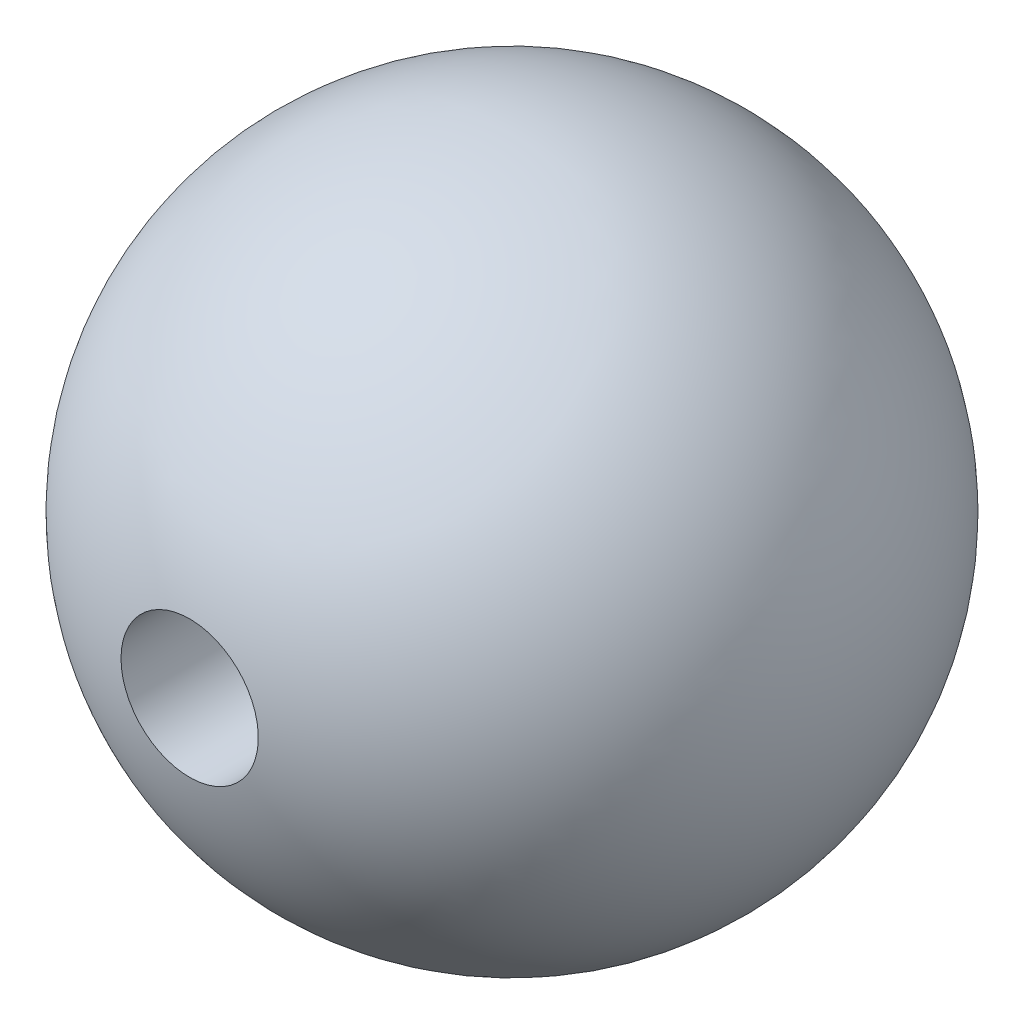
ISO-10303-21;
HEADER;
FILE_DESCRIPTION(('STEP AP214'),'2;1');
FILE_NAME('part.step','',(''),(''),'','','');
FILE_SCHEMA(('AUTOMOTIVE_DESIGN { 1 0 10303 214 1 1 1 1 }'));
ENDSEC;
DATA;
#1=APPLICATION_CONTEXT('core data for automotive mechanical design processes');
#2=APPLICATION_PROTOCOL_DEFINITION('international standard','automotive_design',2000,#1);
#3=PRODUCT_CONTEXT('',#1,'mechanical');
#4=PRODUCT('Part','Part','',(#3));
#5=PRODUCT_RELATED_PRODUCT_CATEGORY('part','',(#4));
#6=PRODUCT_DEFINITION_FORMATION('','',#4);
#7=PRODUCT_DEFINITION_CONTEXT('part definition',#1,'design');
#8=PRODUCT_DEFINITION('design','',#6,#7);
#9=PRODUCT_DEFINITION_SHAPE('','',#8);
#10=(LENGTH_UNIT() NAMED_UNIT(*) SI_UNIT(.MILLI.,.METRE.));
#11=(NAMED_UNIT(*) PLANE_ANGLE_UNIT() SI_UNIT($,.RADIAN.));
#12=(NAMED_UNIT(*) SI_UNIT($,.STERADIAN.) SOLID_ANGLE_UNIT());
#13=UNCERTAINTY_MEASURE_WITH_UNIT(LENGTH_MEASURE(1.E-05),#10,'distance_accuracy_value','');
#14=(GEOMETRIC_REPRESENTATION_CONTEXT(3) GLOBAL_UNCERTAINTY_ASSIGNED_CONTEXT((#13)) GLOBAL_UNIT_ASSIGNED_CONTEXT((#10,
#11,#12)) REPRESENTATION_CONTEXT('',''));
#15=CARTESIAN_POINT('',(0.,0.,0.));
#16=DIRECTION('',(0.,0.,1.));
#17=DIRECTION('',(1.,0.,0.));
#18=AXIS2_PLACEMENT_3D('',#15,#16,#17);
#19=CARTESIAN_POINT('',(0.,0.,0.));
#20=DIRECTION('',(-1.,0.,0.));
#21=DIRECTION('',(0.,1.,0.));
#22=AXIS2_PLACEMENT_3D('',#19,#20,#21);
#23=SPHERICAL_SURFACE('',#22,1.2);
#24=CARTESIAN_POINT('',(0.,0.,0.));
#25=DIRECTION('',(0.,0.,-1.));
#26=DIRECTION('',(-1.,0.,0.));
#27=AXIS2_PLACEMENT_3D('',#24,#25,#26);
#28=SPHERICAL_SURFACE('',#27,1.2);
#29=CARTESIAN_POINT('',(0.,0.,1.17366945943055));
#30=DIRECTION('',(0.,0.,-1.));
#31=DIRECTION('',(-1.,0.,0.));
#32=AXIS2_PLACEMENT_3D('',#29,#30,#31);
#33=CIRCLE('',#32,0.25);
#34=CARTESIAN_POINT('',(-0.25,0.,1.17366945943055));
#35=VERTEX_POINT('',#34);
#36=EDGE_CURVE('E10',#35,#35,#33,.T.);
#37=ORIENTED_EDGE('',*,*,#36,.T.);
#38=EDGE_LOOP('',(#37));
#39=FACE_BOUND('',#38,.T.);
#40=CARTESIAN_POINT('',(0.,0.,-1.17366945943055));
#41=DIRECTION('',(0.,0.,1.));
#42=DIRECTION('',(1.,0.,0.));
#43=AXIS2_PLACEMENT_3D('',#40,#41,#42);
#44=CIRCLE('',#43,0.25);
#45=CARTESIAN_POINT('',(0.25,0.,-1.17366945943055));
#46=VERTEX_POINT('',#45);
#47=EDGE_CURVE('E37',#46,#46,#44,.T.);
#48=ORIENTED_EDGE('',*,*,#47,.T.);
#49=EDGE_LOOP('',(#48));
#50=FACE_BOUND('',#49,.T.);
#51=ADVANCED_FACE('F31',(#39,#50),#28,.T.);
#52=CARTESIAN_POINT('',(0.,0.,-5.));
#53=DIRECTION('',(0.,0.,1.));
#54=DIRECTION('',(1.,0.,0.));
#55=AXIS2_PLACEMENT_3D('',#52,#53,#54);
#56=CYLINDRICAL_SURFACE('',#55,0.25);
#57=ORIENTED_EDGE('',*,*,#47,.F.);
#58=EDGE_LOOP('',(#57));
#59=FACE_BOUND('',#58,.T.);
#60=ORIENTED_EDGE('',*,*,#36,.F.);
#61=EDGE_LOOP('',(#60));
#62=FACE_BOUND('',#61,.T.);
#63=ADVANCED_FACE('F44',(#59,#62),#56,.F.);
#64=CLOSED_SHELL('',(#51,#63));
#65=MANIFOLD_SOLID_BREP('B2',#64);
#66=ADVANCED_BREP_SHAPE_REPRESENTATION('',(#18,#65),#14);
#67=SHAPE_DEFINITION_REPRESENTATION(#9,#66);
ENDSEC;
END-ISO-10303-21;
